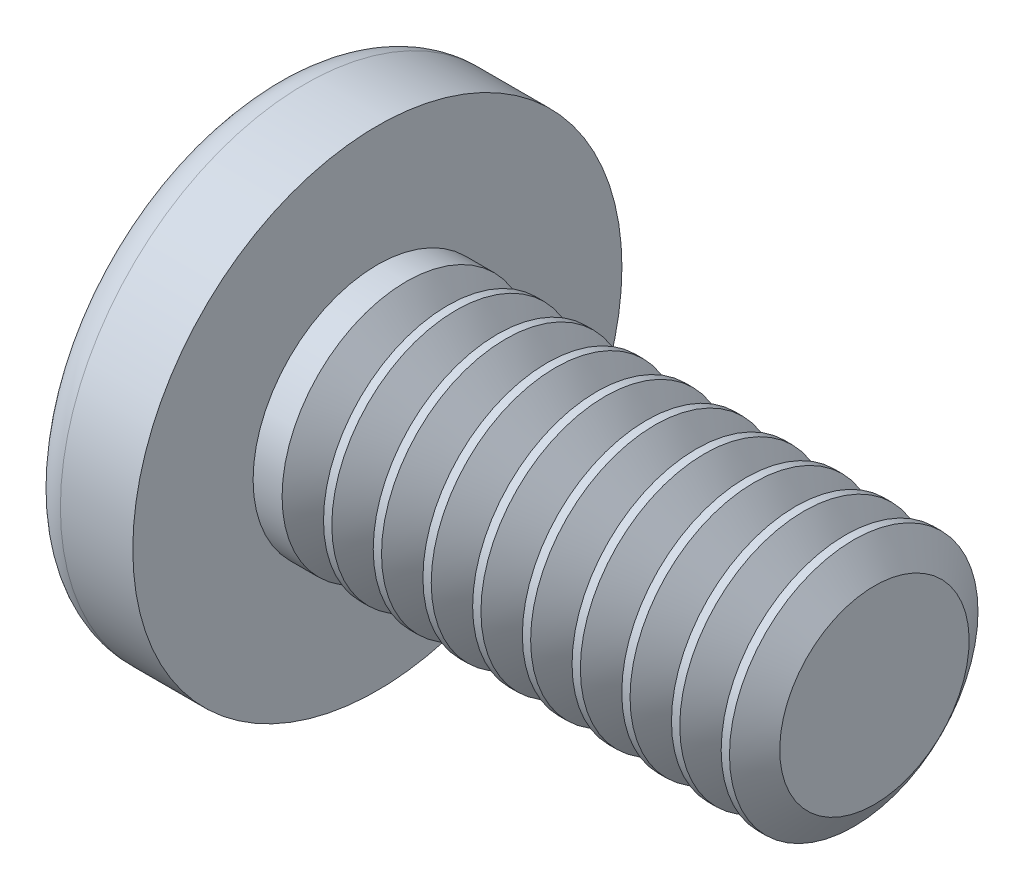
ISO-10303-21;
HEADER;
FILE_DESCRIPTION(('STEP AP214'),'2;1');
FILE_NAME('part.step','',(''),(''),'','','');
FILE_SCHEMA(('AUTOMOTIVE_DESIGN { 1 0 10303 214 1 1 1 1 }'));
ENDSEC;
DATA;
#1=APPLICATION_CONTEXT('core data for automotive mechanical design processes');
#2=APPLICATION_PROTOCOL_DEFINITION('international standard','automotive_design',2000,#1);
#3=PRODUCT_CONTEXT('',#1,'mechanical');
#4=PRODUCT('Part','Part','',(#3));
#5=PRODUCT_RELATED_PRODUCT_CATEGORY('part','',(#4));
#6=PRODUCT_DEFINITION_FORMATION('','',#4);
#7=PRODUCT_DEFINITION_CONTEXT('part definition',#1,'design');
#8=PRODUCT_DEFINITION('design','',#6,#7);
#9=PRODUCT_DEFINITION_SHAPE('','',#8);
#10=(LENGTH_UNIT() NAMED_UNIT(*) SI_UNIT(.MILLI.,.METRE.));
#11=(NAMED_UNIT(*) PLANE_ANGLE_UNIT() SI_UNIT($,.RADIAN.));
#12=(NAMED_UNIT(*) SI_UNIT($,.STERADIAN.) SOLID_ANGLE_UNIT());
#13=UNCERTAINTY_MEASURE_WITH_UNIT(LENGTH_MEASURE(1.E-05),#10,'distance_accuracy_value','');
#14=(GEOMETRIC_REPRESENTATION_CONTEXT(3) GLOBAL_UNCERTAINTY_ASSIGNED_CONTEXT((#13)) GLOBAL_UNIT_ASSIGNED_CONTEXT((#10,
#11,#12)) REPRESENTATION_CONTEXT('',''));
#15=CARTESIAN_POINT('',(0.,0.,0.));
#16=DIRECTION('',(0.,0.,1.));
#17=DIRECTION('',(1.,0.,0.));
#18=AXIS2_PLACEMENT_3D('',#15,#16,#17);
#19=CARTESIAN_POINT('',(10.16,0.,0.));
#20=DIRECTION('',(-1.,0.,0.));
#21=DIRECTION('',(0.,1.,0.));
#22=AXIS2_PLACEMENT_3D('',#19,#20,#21);
#23=SPHERICAL_SURFACE('',#22,10.16);
#24=CARTESIAN_POINT('',(1.86965802236052,0.,0.));
#25=DIRECTION('',(-1.,0.,0.));
#26=DIRECTION('',(0.,0.,1.));
#27=AXIS2_PLACEMENT_3D('',#24,#25,#26);
#28=CIRCLE('',#27,5.87331506849315);
#29=CARTESIAN_POINT('',(1.86965802236052,0.,5.87331506849315));
#30=VERTEX_POINT('',#29);
#31=EDGE_CURVE('E150',#30,#30,#28,.T.);
#32=ORIENTED_EDGE('',*,*,#31,.T.);
#33=EDGE_LOOP('',(#32));
#34=FACE_BOUND('',#33,.T.);
#35=CARTESIAN_POINT('',(10.153449482908,-0.0813167639009209,0.));
#36=DIRECTION('',(-0.0802954503227799,-0.996771107455198,0.));
#37=DIRECTION('',(0.996771107455198,-0.0802954503227799,0.));
#38=AXIS2_PLACEMENT_3D('',#35,#36,#37);
#39=CIRCLE('',#38,10.159672468866);
#40=CARTESIAN_POINT('',(0.652039536999392,0.684074592852814,3.51515714946438));
#41=VERTEX_POINT('',#40);
#42=CARTESIAN_POINT('',(0.0529249432222097,0.732336601795986,0.732336601795989));
#43=VERTEX_POINT('',#42);
#44=EDGE_CURVE('E181',#41,#43,#39,.T.);
#45=ORIENTED_EDGE('',*,*,#44,.F.);
#46=CARTESIAN_POINT('',(8.14988642132873,0.,-2.50394771045556));
#47=DIRECTION('',(0.626014972056276,0.,0.779811037855569));
#48=DIRECTION('',(0.779811037855569,0.,-0.626014972056276));
#49=AXIS2_PLACEMENT_3D('',#46,#47,#48);
#50=CIRCLE('',#49,9.63925771333798);
#51=CARTESIAN_POINT('',(0.652039536999396,-0.684074592852839,3.51515714946437));
#52=VERTEX_POINT('',#51);
#53=EDGE_CURVE('E149',#41,#52,#50,.T.);
#54=ORIENTED_EDGE('',*,*,#53,.T.);
#55=CARTESIAN_POINT('',(10.153449482908,0.0813167639009207,0.));
#56=DIRECTION('',(-0.0802954503227798,0.996771107455198,0.));
#57=DIRECTION('',(-0.996771107455198,-0.0802954503227798,0.));
#58=AXIS2_PLACEMENT_3D('',#55,#56,#57);
#59=CIRCLE('',#58,10.159672468866);
#60=CARTESIAN_POINT('',(0.0529249432222097,-0.732336601795991,0.732336601795988));
#61=VERTEX_POINT('',#60);
#62=EDGE_CURVE('E105',#61,#52,#59,.T.);
#63=ORIENTED_EDGE('',*,*,#62,.F.);
#64=CARTESIAN_POINT('',(10.153449482908,0.,-0.0813167639009207));
#65=DIRECTION('',(-0.0802954503227798,0.,-0.996771107455198));
#66=DIRECTION('',(-0.996771107455198,0.,0.0802954503227798));
#67=AXIS2_PLACEMENT_3D('',#64,#65,#66);
#68=CIRCLE('',#67,10.159672468866);
#69=CARTESIAN_POINT('',(0.652039536999395,-3.51515714946437,0.684074592852826));
#70=VERTEX_POINT('',#69);
#71=EDGE_CURVE('E130',#70,#61,#68,.T.);
#72=ORIENTED_EDGE('',*,*,#71,.F.);
#73=CARTESIAN_POINT('',(8.14988642132873,2.50394771045556,0.));
#74=DIRECTION('',(0.626014972056276,-0.779811037855569,0.));
#75=DIRECTION('',(0.779811037855569,0.626014972056276,0.));
#76=AXIS2_PLACEMENT_3D('',#73,#74,#75);
#77=CIRCLE('',#76,9.63925771333798);
#78=CARTESIAN_POINT('',(0.652039536999396,-3.51515714946437,-0.684074592852826));
#79=VERTEX_POINT('',#78);
#80=EDGE_CURVE('E138',#70,#79,#77,.T.);
#81=ORIENTED_EDGE('',*,*,#80,.T.);
#82=CARTESIAN_POINT('',(10.153449482908,0.,0.0813167639009209));
#83=DIRECTION('',(-0.0802954503227799,0.,0.996771107455198));
#84=DIRECTION('',(0.996771107455198,0.,0.0802954503227799));
#85=AXIS2_PLACEMENT_3D('',#82,#83,#84);
#86=CIRCLE('',#85,10.159672468866);
#87=CARTESIAN_POINT('',(0.0529249432222097,-0.732336601795986,-0.732336601795989));
#88=VERTEX_POINT('',#87);
#89=EDGE_CURVE('E48',#88,#79,#86,.T.);
#90=ORIENTED_EDGE('',*,*,#89,.F.);
#91=CARTESIAN_POINT('',(0.652039536999393,-0.684074592852814,-3.51515714946438));
#92=VERTEX_POINT('',#91);
#93=EDGE_CURVE('E188',#92,#88,#59,.T.);
#94=ORIENTED_EDGE('',*,*,#93,.F.);
#95=CARTESIAN_POINT('',(8.14988642132873,0.,2.50394771045556));
#96=DIRECTION('',(0.626014972056276,0.,-0.779811037855569));
#97=DIRECTION('',(-0.779811037855569,0.,-0.626014972056276));
#98=AXIS2_PLACEMENT_3D('',#95,#96,#97);
#99=CIRCLE('',#98,9.63925771333798);
#100=CARTESIAN_POINT('',(0.652039536999394,0.684074592852839,-3.51515714946437));
#101=VERTEX_POINT('',#100);
#102=EDGE_CURVE('E131',#92,#101,#99,.T.);
#103=ORIENTED_EDGE('',*,*,#102,.T.);
#104=CARTESIAN_POINT('',(0.052924943222208,0.732336601795991,-0.732336601795989));
#105=VERTEX_POINT('',#104);
#106=EDGE_CURVE('E176',#105,#101,#39,.T.);
#107=ORIENTED_EDGE('',*,*,#106,.F.);
#108=CARTESIAN_POINT('',(0.652039536999393,3.51515714946437,-0.684074592852827));
#109=VERTEX_POINT('',#108);
#110=EDGE_CURVE('E41',#109,#105,#86,.T.);
#111=ORIENTED_EDGE('',*,*,#110,.F.);
#112=CARTESIAN_POINT('',(8.14988642132873,-2.50394771045556,0.));
#113=DIRECTION('',(0.626014972056276,0.779811037855569,0.));
#114=DIRECTION('',(-0.779811037855569,0.626014972056276,0.));
#115=AXIS2_PLACEMENT_3D('',#112,#113,#114);
#116=CIRCLE('',#115,9.63925771333798);
#117=CARTESIAN_POINT('',(0.652039536999394,3.51515714946438,0.684074592852827));
#118=VERTEX_POINT('',#117);
#119=EDGE_CURVE('E11',#109,#118,#116,.T.);
#120=ORIENTED_EDGE('',*,*,#119,.T.);
#121=EDGE_CURVE('E164',#43,#118,#68,.T.);
#122=ORIENTED_EDGE('',*,*,#121,.F.);
#123=EDGE_LOOP('',(#45,#54,#63,#72,#81,#90,#94,#103,#107,#111,#120,#122));
#124=FACE_BOUND('',#123,.T.);
#125=ADVANCED_FACE('F33',(#34,#124),#23,.T.);
#126=CARTESIAN_POINT('',(5.03078200692041,0.,-0.331342560553633));
#127=DIRECTION('',(-0.0802954503227799,0.,0.996771107455198));
#128=DIRECTION('',(0.996771107455198,0.,0.0802954503227799));
#129=AXIS2_PLACEMENT_3D('',#126,#127,#128);
#130=PLANE('',#129);
#131=ORIENTED_EDGE('',*,*,#110,.T.);
#132=DIRECTION('',(0.993573291519185,-0.0800378484834902,0.08003784848349));
#133=VECTOR('',#132,1.);
#134=CARTESIAN_POINT('',(5.05713151661847,0.329219961161291,-0.32921996116129));
#135=LINE('',#134,#133);
#136=CARTESIAN_POINT('',(4.572,0.368300000000001,-0.368299999999999));
#137=VERTEX_POINT('',#136);
#138=EDGE_CURVE('E170',#105,#137,#135,.T.);
#139=ORIENTED_EDGE('',*,*,#138,.T.);
#140=DIRECTION('',(0.778276964525241,-0.624783452077207,0.0626945332534222));
#141=VECTOR('',#140,1.);
#142=CARTESIAN_POINT('',(0.,4.0386,-0.7366));
#143=LINE('',#142,#141);
#144=EDGE_CURVE('E154',#109,#137,#143,.T.);
#145=ORIENTED_EDGE('',*,*,#144,.F.);
#146=EDGE_LOOP('',(#131,#139,#145));
#147=FACE_BOUND('',#146,.T.);
#148=ADVANCED_FACE('F169',(#147),#130,.T.);
#149=DIRECTION('',(0.778276964525241,0.624783452077207,0.0626945332534222));
#150=VECTOR('',#149,1.);
#151=CARTESIAN_POINT('',(0.,-4.0386,-0.7366));
#152=LINE('',#151,#150);
#153=CARTESIAN_POINT('',(4.572,-0.3683,-0.3683));
#154=VERTEX_POINT('',#153);
#155=EDGE_CURVE('E139',#79,#154,#152,.T.);
#156=ORIENTED_EDGE('',*,*,#155,.T.);
#157=DIRECTION('',(-0.993573291519185,-0.0800378484834896,-0.08003784848349));
#158=VECTOR('',#157,1.);
#159=CARTESIAN_POINT('',(5.05713151661847,-0.329219961161289,-0.32921996116129));
#160=LINE('',#159,#158);
#161=EDGE_CURVE('E191',#154,#88,#160,.T.);
#162=ORIENTED_EDGE('',*,*,#161,.T.);
#163=ORIENTED_EDGE('',*,*,#89,.T.);
#164=EDGE_LOOP('',(#156,#162,#163));
#165=FACE_BOUND('',#164,.T.);
#166=ADVANCED_FACE('F306',(#165),#130,.T.);
#167=CARTESIAN_POINT('',(5.03078200692042,0.,0.331342560553633));
#168=DIRECTION('',(-0.0802954503227798,0.,-0.996771107455198));
#169=DIRECTION('',(-0.996771107455198,0.,0.0802954503227798));
#170=AXIS2_PLACEMENT_3D('',#167,#168,#169);
#171=PLANE('',#170);
#172=DIRECTION('',(0.778276964525241,-0.624783452077207,-0.0626945332534223));
#173=VECTOR('',#172,1.);
#174=CARTESIAN_POINT('',(0.,4.0386,0.7366));
#175=LINE('',#174,#173);
#176=CARTESIAN_POINT('',(4.572,0.3683,0.3683));
#177=VERTEX_POINT('',#176);
#178=EDGE_CURVE('E749',#118,#177,#175,.T.);
#179=ORIENTED_EDGE('',*,*,#178,.T.);
#180=DIRECTION('',(-0.993573291519185,0.0800378484834897,0.0800378484834899));
#181=VECTOR('',#180,1.);
#182=CARTESIAN_POINT('',(5.05713151661847,0.329219961161289,0.32921996116129));
#183=LINE('',#182,#181);
#184=EDGE_CURVE('E185',#177,#43,#183,.T.);
#185=ORIENTED_EDGE('',*,*,#184,.T.);
#186=ORIENTED_EDGE('',*,*,#121,.T.);
#187=EDGE_LOOP('',(#179,#185,#186));
#188=FACE_BOUND('',#187,.T.);
#189=ADVANCED_FACE('F336',(#188),#171,.T.);
#190=ORIENTED_EDGE('',*,*,#71,.T.);
#191=DIRECTION('',(0.993573291519185,0.0800378484834902,-0.0800378484834899));
#192=VECTOR('',#191,1.);
#193=CARTESIAN_POINT('',(5.05713151661847,-0.329219961161291,0.32921996116129));
#194=LINE('',#193,#192);
#195=CARTESIAN_POINT('',(4.572,-0.368300000000001,0.368299999999999));
#196=VERTEX_POINT('',#195);
#197=EDGE_CURVE('E103',#61,#196,#194,.T.);
#198=ORIENTED_EDGE('',*,*,#197,.T.);
#199=DIRECTION('',(0.778276964525241,0.624783452077207,-0.0626945332534221));
#200=VECTOR('',#199,1.);
#201=CARTESIAN_POINT('',(0.,-4.0386,0.736599999999999));
#202=LINE('',#201,#200);
#203=EDGE_CURVE('E128',#70,#196,#202,.T.);
#204=ORIENTED_EDGE('',*,*,#203,.F.);
#205=EDGE_LOOP('',(#190,#198,#204));
#206=FACE_BOUND('',#205,.T.);
#207=ADVANCED_FACE('F127',(#206),#171,.T.);
#208=CARTESIAN_POINT('',(-25.4,0.,0.));
#209=DIRECTION('',(-1.,0.,0.));
#210=DIRECTION('',(0.,0.,1.));
#211=AXIS2_PLACEMENT_3D('',#208,#209,#210);
#212=CYLINDRICAL_SURFACE('',#211,3.175);
#213=CARTESIAN_POINT('',(5.18588817375183,0.,0.));
#214=DIRECTION('',(-1.,0.,0.));
#215=DIRECTION('',(0.,-1.,0.));
#216=AXIS2_PLACEMENT_3D('',#213,#214,#215);
#217=CIRCLE('',#216,3.175);
#218=CARTESIAN_POINT('',(5.18588817375183,-3.175,0.));
#219=VERTEX_POINT('',#218);
#220=EDGE_CURVE('E203',#219,#219,#217,.T.);
#221=ORIENTED_EDGE('',*,*,#220,.T.);
#222=EDGE_LOOP('',(#221));
#223=FACE_BOUND('',#222,.T.);
#224=CARTESIAN_POINT('',(4.445,0.,0.));
#225=DIRECTION('',(-1.,0.,0.));
#226=DIRECTION('',(0.,0.,1.));
#227=AXIS2_PLACEMENT_3D('',#224,#225,#226);
#228=CIRCLE('',#227,3.175);
#229=CARTESIAN_POINT('',(4.445,0.,3.175));
#230=VERTEX_POINT('',#229);
#231=EDGE_CURVE('E160',#230,#230,#228,.T.);
#232=ORIENTED_EDGE('',*,*,#231,.F.);
#233=EDGE_LOOP('',(#232));
#234=FACE_BOUND('',#233,.T.);
#235=ADVANCED_FACE('F35',(#223,#234),#212,.T.);
#236=CARTESIAN_POINT('',(4.445,3.175,0.));
#237=DIRECTION('',(-1.,0.,0.));
#238=DIRECTION('',(0.,0.,1.));
#239=AXIS2_PLACEMENT_3D('',#236,#237,#238);
#240=PLANE('',#239);
#241=CARTESIAN_POINT('',(4.445,0.,0.));
#242=DIRECTION('',(-1.,0.,0.));
#243=DIRECTION('',(0.,0.,1.));
#244=AXIS2_PLACEMENT_3D('',#241,#242,#243);
#245=CIRCLE('',#244,6.2484);
#246=CARTESIAN_POINT('',(4.445,0.,6.2484));
#247=VERTEX_POINT('',#246);
#248=EDGE_CURVE('E157',#247,#247,#245,.T.);
#249=ORIENTED_EDGE('',*,*,#248,.F.);
#250=EDGE_LOOP('',(#249));
#251=FACE_BOUND('',#250,.T.);
#252=ORIENTED_EDGE('',*,*,#231,.T.);
#253=EDGE_LOOP('',(#252));
#254=FACE_BOUND('',#253,.T.);
#255=ADVANCED_FACE('F316',(#251,#254),#240,.F.);
#256=CARTESIAN_POINT('',(-25.4,0.,0.));
#257=DIRECTION('',(-1.,0.,0.));
#258=DIRECTION('',(0.,0.,1.));
#259=AXIS2_PLACEMENT_3D('',#256,#257,#258);
#260=CYLINDRICAL_SURFACE('',#259,6.2484);
#261=ORIENTED_EDGE('',*,*,#248,.T.);
#262=EDGE_LOOP('',(#261));
#263=FACE_BOUND('',#262,.T.);
#264=CARTESIAN_POINT('',(2.59506294540397,0.,0.));
#265=DIRECTION('',(-1.,0.,0.));
#266=DIRECTION('',(0.,0.,1.));
#267=AXIS2_PLACEMENT_3D('',#264,#265,#266);
#268=CIRCLE('',#267,6.2484);
#269=CARTESIAN_POINT('',(2.59506294540397,0.,6.2484));
#270=VERTEX_POINT('',#269);
#271=EDGE_CURVE('E153',#270,#270,#268,.T.);
#272=ORIENTED_EDGE('',*,*,#271,.F.);
#273=EDGE_LOOP('',(#272));
#274=FACE_BOUND('',#273,.T.);
#275=ADVANCED_FACE('F313',(#263,#274),#260,.T.);
#276=CARTESIAN_POINT('',(2.59506294540397,0.,0.));
#277=DIRECTION('',(-1.,0.,0.));
#278=DIRECTION('',(0.,0.,1.));
#279=AXIS2_PLACEMENT_3D('',#276,#277,#278);
#280=TOROIDAL_SURFACE('',#279,5.3594,0.888999999999999);
#281=ORIENTED_EDGE('',*,*,#271,.T.);
#282=EDGE_LOOP('',(#281));
#283=FACE_BOUND('',#282,.T.);
#284=ORIENTED_EDGE('',*,*,#31,.F.);
#285=EDGE_LOOP('',(#284));
#286=FACE_BOUND('',#285,.T.);
#287=ADVANCED_FACE('F309',(#283,#286),#280,.T.);
#288=CARTESIAN_POINT('',(4.572,0.3683,0.3683));
#289=DIRECTION('',(0.626014972056276,0.779811037855569,0.));
#290=DIRECTION('',(-0.779811037855569,0.626014972056276,0.));
#291=AXIS2_PLACEMENT_3D('',#288,#289,#290);
#292=PLANE('',#291);
#293=ORIENTED_EDGE('',*,*,#144,.T.);
#294=DIRECTION('',(0.,0.,-1.));
#295=VECTOR('',#294,1.);
#296=CARTESIAN_POINT('',(4.572,0.3683,0.3683));
#297=LINE('',#296,#295);
#298=EDGE_CURVE('E121',#177,#137,#297,.T.);
#299=ORIENTED_EDGE('',*,*,#298,.F.);
#300=ORIENTED_EDGE('',*,*,#178,.F.);
#301=ORIENTED_EDGE('',*,*,#119,.F.);
#302=EDGE_LOOP('',(#293,#299,#300,#301));
#303=FACE_BOUND('',#302,.T.);
#304=ADVANCED_FACE('F312',(#303),#292,.F.);
#305=CARTESIAN_POINT('',(4.572,-0.3683,-0.3683));
#306=DIRECTION('',(0.626014972056276,-0.779811037855569,0.));
#307=DIRECTION('',(0.779811037855569,0.626014972056276,0.));
#308=AXIS2_PLACEMENT_3D('',#305,#306,#307);
#309=PLANE('',#308);
#310=ORIENTED_EDGE('',*,*,#203,.T.);
#311=DIRECTION('',(0.,0.,1.));
#312=VECTOR('',#311,1.);
#313=CARTESIAN_POINT('',(4.572,-0.3683,-0.3683));
#314=LINE('',#313,#312);
#315=EDGE_CURVE('E120',#154,#196,#314,.T.);
#316=ORIENTED_EDGE('',*,*,#315,.F.);
#317=ORIENTED_EDGE('',*,*,#155,.F.);
#318=ORIENTED_EDGE('',*,*,#80,.F.);
#319=EDGE_LOOP('',(#310,#316,#317,#318));
#320=FACE_BOUND('',#319,.T.);
#321=ADVANCED_FACE('F135',(#320),#309,.F.);
#322=CARTESIAN_POINT('',(4.572,0.3683,-0.3683));
#323=DIRECTION('',(-1.,0.,0.));
#324=DIRECTION('',(0.,0.,1.));
#325=AXIS2_PLACEMENT_3D('',#322,#323,#324);
#326=PLANE('',#325);
#327=DIRECTION('',(0.,1.,0.));
#328=VECTOR('',#327,1.);
#329=CARTESIAN_POINT('',(4.572,-0.3683,-0.3683));
#330=LINE('',#329,#328);
#331=EDGE_CURVE('E143',#154,#137,#330,.T.);
#332=ORIENTED_EDGE('',*,*,#331,.F.);
#333=ORIENTED_EDGE('',*,*,#315,.T.);
#334=DIRECTION('',(0.,-1.,0.));
#335=VECTOR('',#334,1.);
#336=CARTESIAN_POINT('',(4.572,0.3683,0.3683));
#337=LINE('',#336,#335);
#338=EDGE_CURVE('E112',#177,#196,#337,.T.);
#339=ORIENTED_EDGE('',*,*,#338,.F.);
#340=ORIENTED_EDGE('',*,*,#298,.T.);
#341=EDGE_LOOP('',(#332,#333,#339,#340));
#342=FACE_BOUND('',#341,.T.);
#343=ADVANCED_FACE('F141',(#342),#326,.T.);
#344=CARTESIAN_POINT('',(4.572,0.368300000000001,-0.368299999999999));
#345=DIRECTION('',(0.626014972056276,0.,-0.779811037855569));
#346=DIRECTION('',(0.779811037855569,0.,0.626014972056276));
#347=AXIS2_PLACEMENT_3D('',#344,#345,#346);
#348=PLANE('',#347);
#349=DIRECTION('',(0.778276964525241,0.06269453325342,0.624783452077208));
#350=VECTOR('',#349,1.);
#351=CARTESIAN_POINT('',(0.,-0.736599999999985,-4.0386));
#352=LINE('',#351,#350);
#353=EDGE_CURVE('E196',#92,#154,#352,.T.);
#354=ORIENTED_EDGE('',*,*,#353,.T.);
#355=ORIENTED_EDGE('',*,*,#331,.T.);
#356=DIRECTION('',(0.778276964525241,-0.0626945332534244,0.624783452077207));
#357=VECTOR('',#356,1.);
#358=CARTESIAN_POINT('',(0.,0.736600000000014,-4.0386));
#359=LINE('',#358,#357);
#360=EDGE_CURVE('E109',#101,#137,#359,.T.);
#361=ORIENTED_EDGE('',*,*,#360,.F.);
#362=ORIENTED_EDGE('',*,*,#102,.F.);
#363=EDGE_LOOP('',(#354,#355,#361,#362));
#364=FACE_BOUND('',#363,.T.);
#365=ADVANCED_FACE('F479',(#364),#348,.F.);
#366=CARTESIAN_POINT('',(5.03078200692042,-0.331342560553633,0.));
#367=DIRECTION('',(-0.0802954503227798,0.996771107455198,0.));
#368=DIRECTION('',(-0.996771107455198,-0.0802954503227798,0.));
#369=AXIS2_PLACEMENT_3D('',#366,#367,#368);
#370=PLANE('',#369);
#371=ORIENTED_EDGE('',*,*,#93,.T.);
#372=ORIENTED_EDGE('',*,*,#161,.F.);
#373=ORIENTED_EDGE('',*,*,#353,.F.);
#374=EDGE_LOOP('',(#371,#372,#373));
#375=FACE_BOUND('',#374,.T.);
#376=ADVANCED_FACE('F476',(#375),#370,.T.);
#377=CARTESIAN_POINT('',(5.03078200692041,0.331342560553633,0.));
#378=DIRECTION('',(-0.0802954503227799,-0.996771107455198,0.));
#379=DIRECTION('',(0.996771107455198,-0.0802954503227799,0.));
#380=AXIS2_PLACEMENT_3D('',#377,#378,#379);
#381=PLANE('',#380);
#382=ORIENTED_EDGE('',*,*,#106,.T.);
#383=ORIENTED_EDGE('',*,*,#360,.T.);
#384=ORIENTED_EDGE('',*,*,#138,.F.);
#385=EDGE_LOOP('',(#382,#383,#384));
#386=FACE_BOUND('',#385,.T.);
#387=ADVANCED_FACE('F473',(#386),#381,.T.);
#388=CARTESIAN_POINT('',(4.572,-0.368300000000001,0.368299999999999));
#389=DIRECTION('',(0.626014972056276,0.,0.779811037855569));
#390=DIRECTION('',(-0.779811037855569,0.,0.626014972056276));
#391=AXIS2_PLACEMENT_3D('',#388,#389,#390);
#392=PLANE('',#391);
#393=DIRECTION('',(0.778276964525241,-0.06269453325342,-0.624783452077208));
#394=VECTOR('',#393,1.);
#395=CARTESIAN_POINT('',(0.,0.736599999999986,4.0386));
#396=LINE('',#395,#394);
#397=EDGE_CURVE('E108',#41,#177,#396,.T.);
#398=ORIENTED_EDGE('',*,*,#397,.T.);
#399=ORIENTED_EDGE('',*,*,#338,.T.);
#400=DIRECTION('',(0.778276964525241,0.0626945332534244,-0.624783452077207));
#401=VECTOR('',#400,1.);
#402=CARTESIAN_POINT('',(0.,-0.736600000000014,4.0386));
#403=LINE('',#402,#401);
#404=EDGE_CURVE('E99',#52,#196,#403,.T.);
#405=ORIENTED_EDGE('',*,*,#404,.F.);
#406=ORIENTED_EDGE('',*,*,#53,.F.);
#407=EDGE_LOOP('',(#398,#399,#405,#406));
#408=FACE_BOUND('',#407,.T.);
#409=ADVANCED_FACE('F113',(#408),#392,.F.);
#410=ORIENTED_EDGE('',*,*,#44,.T.);
#411=ORIENTED_EDGE('',*,*,#184,.F.);
#412=ORIENTED_EDGE('',*,*,#397,.F.);
#413=EDGE_LOOP('',(#410,#411,#412));
#414=FACE_BOUND('',#413,.T.);
#415=ADVANCED_FACE('F472',(#414),#381,.T.);
#416=ORIENTED_EDGE('',*,*,#62,.T.);
#417=ORIENTED_EDGE('',*,*,#404,.T.);
#418=ORIENTED_EDGE('',*,*,#197,.F.);
#419=EDGE_LOOP('',(#416,#417,#418));
#420=FACE_BOUND('',#419,.T.);
#421=ADVANCED_FACE('F101',(#420),#370,.T.);
#422=CARTESIAN_POINT('',(6.24411182624816,0.,0.));
#423=DIRECTION('',(1.,0.,0.));
#424=DIRECTION('',(0.,1.,0.));
#425=AXIS2_PLACEMENT_3D('',#422,#423,#424);
#426=CONICAL_SURFACE('',#425,3.175,0.959931088596884);
#427=CARTESIAN_POINT('',(5.715,0.,0.));
#428=DIRECTION('',(-1.,0.,0.));
#429=DIRECTION('',(0.,-1.,0.));
#430=AXIS2_PLACEMENT_3D('',#427,#428,#429);
#431=CIRCLE('',#430,2.41935);
#432=CARTESIAN_POINT('',(5.715,-2.41935,0.));
#433=VERTEX_POINT('',#432);
#434=EDGE_CURVE('E206',#433,#433,#431,.T.);
#435=ORIENTED_EDGE('',*,*,#434,.F.);
#436=EDGE_LOOP('',(#435));
#437=FACE_BOUND('',#436,.T.);
#438=CARTESIAN_POINT('',(6.24411182624816,0.,0.));
#439=DIRECTION('',(-1.,0.,0.));
#440=DIRECTION('',(0.,-1.,0.));
#441=AXIS2_PLACEMENT_3D('',#438,#439,#440);
#442=CIRCLE('',#441,3.175);
#443=CARTESIAN_POINT('',(6.24411182624816,-3.175,0.));
#444=VERTEX_POINT('',#443);
#445=EDGE_CURVE('E198',#444,#444,#442,.T.);
#446=ORIENTED_EDGE('',*,*,#445,.T.);
#447=EDGE_LOOP('',(#446));
#448=FACE_BOUND('',#447,.T.);
#449=ADVANCED_FACE('F354',(#437,#448),#426,.T.);
#450=CARTESIAN_POINT('',(5.715,0.,0.));
#451=DIRECTION('',(-1.,0.,0.));
#452=DIRECTION('',(0.,-1.,0.));
#453=AXIS2_PLACEMENT_3D('',#450,#451,#452);
#454=CONICAL_SURFACE('',#453,2.41935,0.959931088596876);
#455=ORIENTED_EDGE('',*,*,#220,.F.);
#456=EDGE_LOOP('',(#455));
#457=FACE_BOUND('',#456,.T.);
#458=ORIENTED_EDGE('',*,*,#434,.T.);
#459=EDGE_LOOP('',(#458));
#460=FACE_BOUND('',#459,.T.);
#461=ADVANCED_FACE('F344',(#457,#460),#454,.T.);
#462=CARTESIAN_POINT('',(6.45588817375183,0.,0.));
#463=DIRECTION('',(-1.,0.,0.));
#464=DIRECTION('',(0.,-1.,0.));
#465=AXIS2_PLACEMENT_3D('',#462,#463,#464);
#466=CIRCLE('',#465,3.175);
#467=CARTESIAN_POINT('',(6.45588817375183,-3.175,0.));
#468=VERTEX_POINT('',#467);
#469=EDGE_CURVE('E212',#468,#468,#466,.T.);
#470=ORIENTED_EDGE('',*,*,#469,.T.);
#471=EDGE_LOOP('',(#470));
#472=FACE_BOUND('',#471,.T.);
#473=ORIENTED_EDGE('',*,*,#445,.F.);
#474=EDGE_LOOP('',(#473));
#475=FACE_BOUND('',#474,.T.);
#476=ADVANCED_FACE('F324',(#472,#475),#212,.T.);
#477=CARTESIAN_POINT('',(7.51411182624816,0.,0.));
#478=DIRECTION('',(1.,0.,0.));
#479=DIRECTION('',(0.,1.,0.));
#480=AXIS2_PLACEMENT_3D('',#477,#478,#479);
#481=CONICAL_SURFACE('',#480,3.175,0.959931088596884);
#482=CARTESIAN_POINT('',(6.985,0.,0.));
#483=DIRECTION('',(-1.,0.,0.));
#484=DIRECTION('',(0.,-1.,0.));
#485=AXIS2_PLACEMENT_3D('',#482,#483,#484);
#486=CIRCLE('',#485,2.41935);
#487=CARTESIAN_POINT('',(6.985,-2.41935,0.));
#488=VERTEX_POINT('',#487);
#489=EDGE_CURVE('E215',#488,#488,#486,.T.);
#490=ORIENTED_EDGE('',*,*,#489,.F.);
#491=EDGE_LOOP('',(#490));
#492=FACE_BOUND('',#491,.T.);
#493=CARTESIAN_POINT('',(7.51411182624816,0.,0.));
#494=DIRECTION('',(-1.,0.,0.));
#495=DIRECTION('',(0.,-1.,0.));
#496=AXIS2_PLACEMENT_3D('',#493,#494,#495);
#497=CIRCLE('',#496,3.175);
#498=CARTESIAN_POINT('',(7.51411182624816,-3.175,0.));
#499=VERTEX_POINT('',#498);
#500=EDGE_CURVE('E209',#499,#499,#497,.T.);
#501=ORIENTED_EDGE('',*,*,#500,.T.);
#502=EDGE_LOOP('',(#501));
#503=FACE_BOUND('',#502,.T.);
#504=ADVANCED_FACE('F343',(#492,#503),#481,.T.);
#505=CARTESIAN_POINT('',(6.985,0.,0.));
#506=DIRECTION('',(-1.,0.,0.));
#507=DIRECTION('',(0.,-1.,0.));
#508=AXIS2_PLACEMENT_3D('',#505,#506,#507);
#509=CONICAL_SURFACE('',#508,2.41935,0.959931088596876);
#510=ORIENTED_EDGE('',*,*,#469,.F.);
#511=EDGE_LOOP('',(#510));
#512=FACE_BOUND('',#511,.T.);
#513=ORIENTED_EDGE('',*,*,#489,.T.);
#514=EDGE_LOOP('',(#513));
#515=FACE_BOUND('',#514,.T.);
#516=ADVANCED_FACE('F351',(#512,#515),#509,.T.);
#517=CARTESIAN_POINT('',(7.72588817375183,0.,0.));
#518=DIRECTION('',(-1.,0.,0.));
#519=DIRECTION('',(0.,-1.,0.));
#520=AXIS2_PLACEMENT_3D('',#517,#518,#519);
#521=CIRCLE('',#520,3.175);
#522=CARTESIAN_POINT('',(7.72588817375183,-3.175,0.));
#523=VERTEX_POINT('',#522);
#524=EDGE_CURVE('E221',#523,#523,#521,.T.);
#525=ORIENTED_EDGE('',*,*,#524,.T.);
#526=EDGE_LOOP('',(#525));
#527=FACE_BOUND('',#526,.T.);
#528=ORIENTED_EDGE('',*,*,#500,.F.);
#529=EDGE_LOOP('',(#528));
#530=FACE_BOUND('',#529,.T.);
#531=ADVANCED_FACE('F346',(#527,#530),#212,.T.);
#532=CARTESIAN_POINT('',(8.78411182624816,0.,0.));
#533=DIRECTION('',(1.,0.,0.));
#534=DIRECTION('',(0.,1.,0.));
#535=AXIS2_PLACEMENT_3D('',#532,#533,#534);
#536=CONICAL_SURFACE('',#535,3.175,0.959931088596884);
#537=CARTESIAN_POINT('',(8.255,0.,0.));
#538=DIRECTION('',(-1.,0.,0.));
#539=DIRECTION('',(0.,-1.,0.));
#540=AXIS2_PLACEMENT_3D('',#537,#538,#539);
#541=CIRCLE('',#540,2.41935);
#542=CARTESIAN_POINT('',(8.255,-2.41935,0.));
#543=VERTEX_POINT('',#542);
#544=EDGE_CURVE('E224',#543,#543,#541,.T.);
#545=ORIENTED_EDGE('',*,*,#544,.F.);
#546=EDGE_LOOP('',(#545));
#547=FACE_BOUND('',#546,.T.);
#548=CARTESIAN_POINT('',(8.78411182624816,0.,0.));
#549=DIRECTION('',(-1.,0.,0.));
#550=DIRECTION('',(0.,-1.,0.));
#551=AXIS2_PLACEMENT_3D('',#548,#549,#550);
#552=CIRCLE('',#551,3.175);
#553=CARTESIAN_POINT('',(8.78411182624816,-3.175,0.));
#554=VERTEX_POINT('',#553);
#555=EDGE_CURVE('E218',#554,#554,#552,.T.);
#556=ORIENTED_EDGE('',*,*,#555,.T.);
#557=EDGE_LOOP('',(#556));
#558=FACE_BOUND('',#557,.T.);
#559=ADVANCED_FACE('F359',(#547,#558),#536,.T.);
#560=CARTESIAN_POINT('',(8.255,0.,0.));
#561=DIRECTION('',(-1.,0.,0.));
#562=DIRECTION('',(0.,-1.,0.));
#563=AXIS2_PLACEMENT_3D('',#560,#561,#562);
#564=CONICAL_SURFACE('',#563,2.41935,0.959931088596876);
#565=ORIENTED_EDGE('',*,*,#524,.F.);
#566=EDGE_LOOP('',(#565));
#567=FACE_BOUND('',#566,.T.);
#568=ORIENTED_EDGE('',*,*,#544,.T.);
#569=EDGE_LOOP('',(#568));
#570=FACE_BOUND('',#569,.T.);
#571=ADVANCED_FACE('F366',(#567,#570),#564,.T.);
#572=CARTESIAN_POINT('',(8.99588817375183,0.,0.));
#573=DIRECTION('',(-1.,0.,0.));
#574=DIRECTION('',(0.,-1.,0.));
#575=AXIS2_PLACEMENT_3D('',#572,#573,#574);
#576=CIRCLE('',#575,3.175);
#577=CARTESIAN_POINT('',(8.99588817375183,-3.175,0.));
#578=VERTEX_POINT('',#577);
#579=EDGE_CURVE('E230',#578,#578,#576,.T.);
#580=ORIENTED_EDGE('',*,*,#579,.T.);
#581=EDGE_LOOP('',(#580));
#582=FACE_BOUND('',#581,.T.);
#583=ORIENTED_EDGE('',*,*,#555,.F.);
#584=EDGE_LOOP('',(#583));
#585=FACE_BOUND('',#584,.T.);
#586=ADVANCED_FACE('F361',(#582,#585),#212,.T.);
#587=CARTESIAN_POINT('',(10.0541118262482,0.,0.));
#588=DIRECTION('',(1.,0.,0.));
#589=DIRECTION('',(0.,1.,0.));
#590=AXIS2_PLACEMENT_3D('',#587,#588,#589);
#591=CONICAL_SURFACE('',#590,3.175,0.959931088596884);
#592=CARTESIAN_POINT('',(9.525,0.,0.));
#593=DIRECTION('',(-1.,0.,0.));
#594=DIRECTION('',(0.,-1.,0.));
#595=AXIS2_PLACEMENT_3D('',#592,#593,#594);
#596=CIRCLE('',#595,2.41935);
#597=CARTESIAN_POINT('',(9.525,-2.41935,0.));
#598=VERTEX_POINT('',#597);
#599=EDGE_CURVE('E233',#598,#598,#596,.T.);
#600=ORIENTED_EDGE('',*,*,#599,.F.);
#601=EDGE_LOOP('',(#600));
#602=FACE_BOUND('',#601,.T.);
#603=CARTESIAN_POINT('',(10.0541118262482,0.,0.));
#604=DIRECTION('',(-1.,0.,0.));
#605=DIRECTION('',(0.,-1.,0.));
#606=AXIS2_PLACEMENT_3D('',#603,#604,#605);
#607=CIRCLE('',#606,3.175);
#608=CARTESIAN_POINT('',(10.0541118262482,-3.175,0.));
#609=VERTEX_POINT('',#608);
#610=EDGE_CURVE('E227',#609,#609,#607,.T.);
#611=ORIENTED_EDGE('',*,*,#610,.T.);
#612=EDGE_LOOP('',(#611));
#613=FACE_BOUND('',#612,.T.);
#614=ADVANCED_FACE('F373',(#602,#613),#591,.T.);
#615=CARTESIAN_POINT('',(9.525,0.,0.));
#616=DIRECTION('',(-1.,0.,0.));
#617=DIRECTION('',(0.,-1.,0.));
#618=AXIS2_PLACEMENT_3D('',#615,#616,#617);
#619=CONICAL_SURFACE('',#618,2.41935,0.959931088596876);
#620=ORIENTED_EDGE('',*,*,#579,.F.);
#621=EDGE_LOOP('',(#620));
#622=FACE_BOUND('',#621,.T.);
#623=ORIENTED_EDGE('',*,*,#599,.T.);
#624=EDGE_LOOP('',(#623));
#625=FACE_BOUND('',#624,.T.);
#626=ADVANCED_FACE('F380',(#622,#625),#619,.T.);
#627=CARTESIAN_POINT('',(10.2658881737518,0.,0.));
#628=DIRECTION('',(-1.,0.,0.));
#629=DIRECTION('',(0.,-1.,0.));
#630=AXIS2_PLACEMENT_3D('',#627,#628,#629);
#631=CIRCLE('',#630,3.175);
#632=CARTESIAN_POINT('',(10.2658881737518,-3.175,0.));
#633=VERTEX_POINT('',#632);
#634=EDGE_CURVE('E239',#633,#633,#631,.T.);
#635=ORIENTED_EDGE('',*,*,#634,.T.);
#636=EDGE_LOOP('',(#635));
#637=FACE_BOUND('',#636,.T.);
#638=ORIENTED_EDGE('',*,*,#610,.F.);
#639=EDGE_LOOP('',(#638));
#640=FACE_BOUND('',#639,.T.);
#641=ADVANCED_FACE('F375',(#637,#640),#212,.T.);
#642=CARTESIAN_POINT('',(11.3241118262482,0.,0.));
#643=DIRECTION('',(1.,0.,0.));
#644=DIRECTION('',(0.,1.,0.));
#645=AXIS2_PLACEMENT_3D('',#642,#643,#644);
#646=CONICAL_SURFACE('',#645,3.175,0.959931088596884);
#647=CARTESIAN_POINT('',(10.795,0.,0.));
#648=DIRECTION('',(-1.,0.,0.));
#649=DIRECTION('',(0.,-1.,0.));
#650=AXIS2_PLACEMENT_3D('',#647,#648,#649);
#651=CIRCLE('',#650,2.41935);
#652=CARTESIAN_POINT('',(10.795,-2.41935,0.));
#653=VERTEX_POINT('',#652);
#654=EDGE_CURVE('E242',#653,#653,#651,.T.);
#655=ORIENTED_EDGE('',*,*,#654,.F.);
#656=EDGE_LOOP('',(#655));
#657=FACE_BOUND('',#656,.T.);
#658=CARTESIAN_POINT('',(11.3241118262482,0.,0.));
#659=DIRECTION('',(-1.,0.,0.));
#660=DIRECTION('',(0.,-1.,0.));
#661=AXIS2_PLACEMENT_3D('',#658,#659,#660);
#662=CIRCLE('',#661,3.175);
#663=CARTESIAN_POINT('',(11.3241118262482,-3.175,0.));
#664=VERTEX_POINT('',#663);
#665=EDGE_CURVE('E236',#664,#664,#662,.T.);
#666=ORIENTED_EDGE('',*,*,#665,.T.);
#667=EDGE_LOOP('',(#666));
#668=FACE_BOUND('',#667,.T.);
#669=ADVANCED_FACE('F387',(#657,#668),#646,.T.);
#670=CARTESIAN_POINT('',(10.795,0.,0.));
#671=DIRECTION('',(-1.,0.,0.));
#672=DIRECTION('',(0.,-1.,0.));
#673=AXIS2_PLACEMENT_3D('',#670,#671,#672);
#674=CONICAL_SURFACE('',#673,2.41935,0.959931088596876);
#675=ORIENTED_EDGE('',*,*,#634,.F.);
#676=EDGE_LOOP('',(#675));
#677=FACE_BOUND('',#676,.T.);
#678=ORIENTED_EDGE('',*,*,#654,.T.);
#679=EDGE_LOOP('',(#678));
#680=FACE_BOUND('',#679,.T.);
#681=ADVANCED_FACE('F394',(#677,#680),#674,.T.);
#682=CARTESIAN_POINT('',(11.5358881737518,0.,0.));
#683=DIRECTION('',(-1.,0.,0.));
#684=DIRECTION('',(0.,-1.,0.));
#685=AXIS2_PLACEMENT_3D('',#682,#683,#684);
#686=CIRCLE('',#685,3.175);
#687=CARTESIAN_POINT('',(11.5358881737518,-3.175,0.));
#688=VERTEX_POINT('',#687);
#689=EDGE_CURVE('E248',#688,#688,#686,.T.);
#690=ORIENTED_EDGE('',*,*,#689,.T.);
#691=EDGE_LOOP('',(#690));
#692=FACE_BOUND('',#691,.T.);
#693=ORIENTED_EDGE('',*,*,#665,.F.);
#694=EDGE_LOOP('',(#693));
#695=FACE_BOUND('',#694,.T.);
#696=ADVANCED_FACE('F389',(#692,#695),#212,.T.);
#697=CARTESIAN_POINT('',(12.5941118262482,0.,0.));
#698=DIRECTION('',(1.,0.,0.));
#699=DIRECTION('',(0.,1.,0.));
#700=AXIS2_PLACEMENT_3D('',#697,#698,#699);
#701=CONICAL_SURFACE('',#700,3.175,0.959931088596884);
#702=CARTESIAN_POINT('',(12.065,0.,0.));
#703=DIRECTION('',(-1.,0.,0.));
#704=DIRECTION('',(0.,-1.,0.));
#705=AXIS2_PLACEMENT_3D('',#702,#703,#704);
#706=CIRCLE('',#705,2.41935);
#707=CARTESIAN_POINT('',(12.065,-2.41935,0.));
#708=VERTEX_POINT('',#707);
#709=EDGE_CURVE('E251',#708,#708,#706,.T.);
#710=ORIENTED_EDGE('',*,*,#709,.F.);
#711=EDGE_LOOP('',(#710));
#712=FACE_BOUND('',#711,.T.);
#713=CARTESIAN_POINT('',(12.5941118262482,0.,0.));
#714=DIRECTION('',(-1.,0.,0.));
#715=DIRECTION('',(0.,-1.,0.));
#716=AXIS2_PLACEMENT_3D('',#713,#714,#715);
#717=CIRCLE('',#716,3.175);
#718=CARTESIAN_POINT('',(12.5941118262482,-3.175,0.));
#719=VERTEX_POINT('',#718);
#720=EDGE_CURVE('E245',#719,#719,#717,.T.);
#721=ORIENTED_EDGE('',*,*,#720,.T.);
#722=EDGE_LOOP('',(#721));
#723=FACE_BOUND('',#722,.T.);
#724=ADVANCED_FACE('F401',(#712,#723),#701,.T.);
#725=CARTESIAN_POINT('',(12.065,0.,0.));
#726=DIRECTION('',(-1.,0.,0.));
#727=DIRECTION('',(0.,-1.,0.));
#728=AXIS2_PLACEMENT_3D('',#725,#726,#727);
#729=CONICAL_SURFACE('',#728,2.41935,0.959931088596876);
#730=ORIENTED_EDGE('',*,*,#689,.F.);
#731=EDGE_LOOP('',(#730));
#732=FACE_BOUND('',#731,.T.);
#733=ORIENTED_EDGE('',*,*,#709,.T.);
#734=EDGE_LOOP('',(#733));
#735=FACE_BOUND('',#734,.T.);
#736=ADVANCED_FACE('F408',(#732,#735),#729,.T.);
#737=CARTESIAN_POINT('',(12.8058881737518,0.,0.));
#738=DIRECTION('',(-1.,0.,0.));
#739=DIRECTION('',(0.,-1.,0.));
#740=AXIS2_PLACEMENT_3D('',#737,#738,#739);
#741=CIRCLE('',#740,3.175);
#742=CARTESIAN_POINT('',(12.8058881737518,-3.175,0.));
#743=VERTEX_POINT('',#742);
#744=EDGE_CURVE('E257',#743,#743,#741,.T.);
#745=ORIENTED_EDGE('',*,*,#744,.T.);
#746=EDGE_LOOP('',(#745));
#747=FACE_BOUND('',#746,.T.);
#748=ORIENTED_EDGE('',*,*,#720,.F.);
#749=EDGE_LOOP('',(#748));
#750=FACE_BOUND('',#749,.T.);
#751=ADVANCED_FACE('F403',(#747,#750),#212,.T.);
#752=CARTESIAN_POINT('',(13.8641118262482,0.,0.));
#753=DIRECTION('',(1.,0.,0.));
#754=DIRECTION('',(0.,1.,0.));
#755=AXIS2_PLACEMENT_3D('',#752,#753,#754);
#756=CONICAL_SURFACE('',#755,3.175,0.959931088596884);
#757=CARTESIAN_POINT('',(13.335,0.,0.));
#758=DIRECTION('',(-1.,0.,0.));
#759=DIRECTION('',(0.,-1.,0.));
#760=AXIS2_PLACEMENT_3D('',#757,#758,#759);
#761=CIRCLE('',#760,2.41935);
#762=CARTESIAN_POINT('',(13.335,-2.41935,0.));
#763=VERTEX_POINT('',#762);
#764=EDGE_CURVE('E260',#763,#763,#761,.T.);
#765=ORIENTED_EDGE('',*,*,#764,.F.);
#766=EDGE_LOOP('',(#765));
#767=FACE_BOUND('',#766,.T.);
#768=CARTESIAN_POINT('',(13.8641118262482,0.,0.));
#769=DIRECTION('',(-1.,0.,0.));
#770=DIRECTION('',(0.,-1.,0.));
#771=AXIS2_PLACEMENT_3D('',#768,#769,#770);
#772=CIRCLE('',#771,3.175);
#773=CARTESIAN_POINT('',(13.8641118262482,-3.175,0.));
#774=VERTEX_POINT('',#773);
#775=EDGE_CURVE('E254',#774,#774,#772,.T.);
#776=ORIENTED_EDGE('',*,*,#775,.T.);
#777=EDGE_LOOP('',(#776));
#778=FACE_BOUND('',#777,.T.);
#779=ADVANCED_FACE('F415',(#767,#778),#756,.T.);
#780=CARTESIAN_POINT('',(13.335,0.,0.));
#781=DIRECTION('',(-1.,0.,0.));
#782=DIRECTION('',(0.,-1.,0.));
#783=AXIS2_PLACEMENT_3D('',#780,#781,#782);
#784=CONICAL_SURFACE('',#783,2.41935,0.959931088596876);
#785=ORIENTED_EDGE('',*,*,#744,.F.);
#786=EDGE_LOOP('',(#785));
#787=FACE_BOUND('',#786,.T.);
#788=ORIENTED_EDGE('',*,*,#764,.T.);
#789=EDGE_LOOP('',(#788));
#790=FACE_BOUND('',#789,.T.);
#791=ADVANCED_FACE('F422',(#787,#790),#784,.T.);
#792=CARTESIAN_POINT('',(14.0758881737518,0.,0.));
#793=DIRECTION('',(-1.,0.,0.));
#794=DIRECTION('',(0.,-1.,0.));
#795=AXIS2_PLACEMENT_3D('',#792,#793,#794);
#796=CIRCLE('',#795,3.175);
#797=CARTESIAN_POINT('',(14.0758881737518,-3.175,0.));
#798=VERTEX_POINT('',#797);
#799=EDGE_CURVE('E266',#798,#798,#796,.T.);
#800=ORIENTED_EDGE('',*,*,#799,.T.);
#801=EDGE_LOOP('',(#800));
#802=FACE_BOUND('',#801,.T.);
#803=ORIENTED_EDGE('',*,*,#775,.F.);
#804=EDGE_LOOP('',(#803));
#805=FACE_BOUND('',#804,.T.);
#806=ADVANCED_FACE('F417',(#802,#805),#212,.T.);
#807=CARTESIAN_POINT('',(15.1341118262482,0.,0.));
#808=DIRECTION('',(1.,0.,0.));
#809=DIRECTION('',(0.,1.,0.));
#810=AXIS2_PLACEMENT_3D('',#807,#808,#809);
#811=CONICAL_SURFACE('',#810,3.175,0.959931088596884);
#812=CARTESIAN_POINT('',(14.605,0.,0.));
#813=DIRECTION('',(-1.,0.,0.));
#814=DIRECTION('',(0.,-1.,0.));
#815=AXIS2_PLACEMENT_3D('',#812,#813,#814);
#816=CIRCLE('',#815,2.41935);
#817=CARTESIAN_POINT('',(14.605,-2.41935,0.));
#818=VERTEX_POINT('',#817);
#819=EDGE_CURVE('E269',#818,#818,#816,.T.);
#820=ORIENTED_EDGE('',*,*,#819,.F.);
#821=EDGE_LOOP('',(#820));
#822=FACE_BOUND('',#821,.T.);
#823=CARTESIAN_POINT('',(15.1341118262482,0.,0.));
#824=DIRECTION('',(-1.,0.,0.));
#825=DIRECTION('',(0.,-1.,0.));
#826=AXIS2_PLACEMENT_3D('',#823,#824,#825);
#827=CIRCLE('',#826,3.175);
#828=CARTESIAN_POINT('',(15.1341118262482,-3.175,0.));
#829=VERTEX_POINT('',#828);
#830=EDGE_CURVE('E263',#829,#829,#827,.T.);
#831=ORIENTED_EDGE('',*,*,#830,.T.);
#832=EDGE_LOOP('',(#831));
#833=FACE_BOUND('',#832,.T.);
#834=ADVANCED_FACE('F429',(#822,#833),#811,.T.);
#835=CARTESIAN_POINT('',(14.605,0.,0.));
#836=DIRECTION('',(-1.,0.,0.));
#837=DIRECTION('',(0.,-1.,0.));
#838=AXIS2_PLACEMENT_3D('',#835,#836,#837);
#839=CONICAL_SURFACE('',#838,2.41935,0.959931088596876);
#840=ORIENTED_EDGE('',*,*,#799,.F.);
#841=EDGE_LOOP('',(#840));
#842=FACE_BOUND('',#841,.T.);
#843=ORIENTED_EDGE('',*,*,#819,.T.);
#844=EDGE_LOOP('',(#843));
#845=FACE_BOUND('',#844,.T.);
#846=ADVANCED_FACE('F435',(#842,#845),#839,.T.);
#847=CARTESIAN_POINT('',(15.3458881737518,0.,0.));
#848=DIRECTION('',(-1.,0.,0.));
#849=DIRECTION('',(0.,-1.,0.));
#850=AXIS2_PLACEMENT_3D('',#847,#848,#849);
#851=CIRCLE('',#850,3.175);
#852=CARTESIAN_POINT('',(15.3458881737518,-3.175,0.));
#853=VERTEX_POINT('',#852);
#854=EDGE_CURVE('E275',#853,#853,#851,.T.);
#855=ORIENTED_EDGE('',*,*,#854,.T.);
#856=EDGE_LOOP('',(#855));
#857=FACE_BOUND('',#856,.T.);
#858=ORIENTED_EDGE('',*,*,#830,.F.);
#859=EDGE_LOOP('',(#858));
#860=FACE_BOUND('',#859,.T.);
#861=ADVANCED_FACE('F341',(#857,#860),#212,.T.);
#862=CARTESIAN_POINT('',(16.4041118262482,0.,0.));
#863=DIRECTION('',(1.,0.,0.));
#864=DIRECTION('',(0.,1.,0.));
#865=AXIS2_PLACEMENT_3D('',#862,#863,#864);
#866=CONICAL_SURFACE('',#865,3.175,0.959931088596884);
#867=CARTESIAN_POINT('',(15.875,0.,0.));
#868=DIRECTION('',(-1.,0.,0.));
#869=DIRECTION('',(0.,-1.,0.));
#870=AXIS2_PLACEMENT_3D('',#867,#868,#869);
#871=CIRCLE('',#870,2.41935);
#872=CARTESIAN_POINT('',(15.875,-2.41935,0.));
#873=VERTEX_POINT('',#872);
#874=EDGE_CURVE('E278',#873,#873,#871,.T.);
#875=ORIENTED_EDGE('',*,*,#874,.F.);
#876=EDGE_LOOP('',(#875));
#877=FACE_BOUND('',#876,.T.);
#878=CARTESIAN_POINT('',(16.4041118262482,0.,0.));
#879=DIRECTION('',(-1.,0.,0.));
#880=DIRECTION('',(0.,-1.,0.));
#881=AXIS2_PLACEMENT_3D('',#878,#879,#880);
#882=CIRCLE('',#881,3.175);
#883=CARTESIAN_POINT('',(16.4041118262482,-3.175,0.));
#884=VERTEX_POINT('',#883);
#885=EDGE_CURVE('E272',#884,#884,#882,.T.);
#886=ORIENTED_EDGE('',*,*,#885,.T.);
#887=EDGE_LOOP('',(#886));
#888=FACE_BOUND('',#887,.T.);
#889=ADVANCED_FACE('F442',(#877,#888),#866,.T.);
#890=CARTESIAN_POINT('',(15.875,0.,0.));
#891=DIRECTION('',(-1.,0.,0.));
#892=DIRECTION('',(0.,-1.,0.));
#893=AXIS2_PLACEMENT_3D('',#890,#891,#892);
#894=CONICAL_SURFACE('',#893,2.41935,0.959931088596876);
#895=ORIENTED_EDGE('',*,*,#854,.F.);
#896=EDGE_LOOP('',(#895));
#897=FACE_BOUND('',#896,.T.);
#898=ORIENTED_EDGE('',*,*,#874,.T.);
#899=EDGE_LOOP('',(#898));
#900=FACE_BOUND('',#899,.T.);
#901=ADVANCED_FACE('F339',(#897,#900),#894,.T.);
#902=CARTESIAN_POINT('',(16.6158881737518,0.,0.));
#903=DIRECTION('',(-1.,0.,0.));
#904=DIRECTION('',(0.,-1.,0.));
#905=AXIS2_PLACEMENT_3D('',#902,#903,#904);
#906=CIRCLE('',#905,3.175);
#907=CARTESIAN_POINT('',(16.6158881737518,-3.175,0.));
#908=VERTEX_POINT('',#907);
#909=EDGE_CURVE('E281',#908,#908,#906,.T.);
#910=ORIENTED_EDGE('',*,*,#909,.T.);
#911=EDGE_LOOP('',(#910));
#912=FACE_BOUND('',#911,.T.);
#913=ORIENTED_EDGE('',*,*,#885,.F.);
#914=EDGE_LOOP('',(#913));
#915=FACE_BOUND('',#914,.T.);
#916=ADVANCED_FACE('F296',(#912,#915),#212,.T.);
#917=CARTESIAN_POINT('',(17.145,0.,0.));
#918=DIRECTION('',(-1.,0.,0.));
#919=DIRECTION('',(0.,-1.,0.));
#920=AXIS2_PLACEMENT_3D('',#917,#918,#919);
#921=CONICAL_SURFACE('',#920,2.41935,0.959931088596876);
#922=ORIENTED_EDGE('',*,*,#909,.F.);
#923=EDGE_LOOP('',(#922));
#924=FACE_BOUND('',#923,.T.);
#925=CARTESIAN_POINT('',(17.145,0.,0.));
#926=DIRECTION('',(-1.,0.,0.));
#927=DIRECTION('',(0.,-1.,0.));
#928=AXIS2_PLACEMENT_3D('',#925,#926,#927);
#929=CIRCLE('',#928,2.41935);
#930=CARTESIAN_POINT('',(17.145,-2.41935,0.));
#931=VERTEX_POINT('',#930);
#932=EDGE_CURVE('E284',#931,#931,#929,.T.);
#933=ORIENTED_EDGE('',*,*,#932,.T.);
#934=EDGE_LOOP('',(#933));
#935=FACE_BOUND('',#934,.T.);
#936=ADVANCED_FACE('F288',(#924,#935),#921,.T.);
#937=CARTESIAN_POINT('',(17.145,3.175,0.));
#938=DIRECTION('',(1.,0.,0.));
#939=DIRECTION('',(0.,0.,-1.));
#940=AXIS2_PLACEMENT_3D('',#937,#938,#939);
#941=PLANE('',#940);
#942=ORIENTED_EDGE('',*,*,#932,.F.);
#943=EDGE_LOOP('',(#942));
#944=FACE_BOUND('',#943,.T.);
#945=ADVANCED_FACE('F290',(#944),#941,.T.);
#946=CLOSED_SHELL('',(#125,#148,#166,#189,#207,#235,#255,#275,#287,#304,#321,#343,#365,#376,
#387,#409,#415,#421,#449,#461,#476,#504,#516,#531,#559,#571,#586,#614,#626,#641,#669,#681,#696,
#724,#736,#751,#779,#791,#806,#834,#846,#861,#889,#901,#916,#936,#945));
#947=MANIFOLD_SOLID_BREP('B2',#946);
#948=ADVANCED_BREP_SHAPE_REPRESENTATION('',(#18,#947),#14);
#949=SHAPE_DEFINITION_REPRESENTATION(#9,#948);
ENDSEC;
END-ISO-10303-21;
